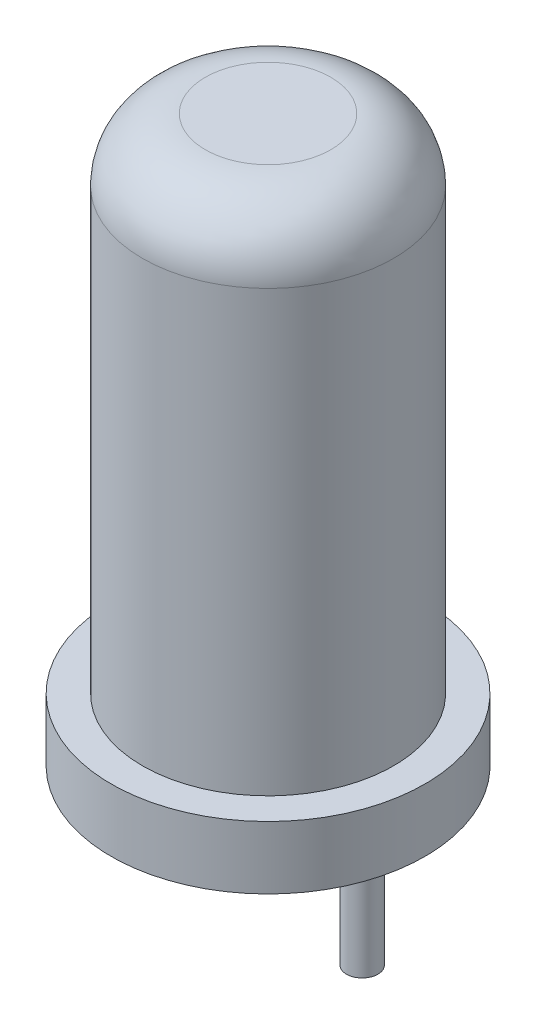
ISO-10303-21;
HEADER;
FILE_DESCRIPTION(('STEP AP214'),'2;1');
FILE_NAME('part.step','',(''),(''),'','','');
FILE_SCHEMA(('AUTOMOTIVE_DESIGN { 1 0 10303 214 1 1 1 1 }'));
ENDSEC;
DATA;
#1=APPLICATION_CONTEXT('core data for automotive mechanical design processes');
#2=APPLICATION_PROTOCOL_DEFINITION('international standard','automotive_design',2000,#1);
#3=PRODUCT_CONTEXT('',#1,'mechanical');
#4=PRODUCT('Part','Part','',(#3));
#5=PRODUCT_RELATED_PRODUCT_CATEGORY('part','',(#4));
#6=PRODUCT_DEFINITION_FORMATION('','',#4);
#7=PRODUCT_DEFINITION_CONTEXT('part definition',#1,'design');
#8=PRODUCT_DEFINITION('design','',#6,#7);
#9=PRODUCT_DEFINITION_SHAPE('','',#8);
#10=(LENGTH_UNIT() NAMED_UNIT(*) SI_UNIT(.MILLI.,.METRE.));
#11=(NAMED_UNIT(*) PLANE_ANGLE_UNIT() SI_UNIT($,.RADIAN.));
#12=(NAMED_UNIT(*) SI_UNIT($,.STERADIAN.) SOLID_ANGLE_UNIT());
#13=UNCERTAINTY_MEASURE_WITH_UNIT(LENGTH_MEASURE(1.E-05),#10,'distance_accuracy_value','');
#14=(GEOMETRIC_REPRESENTATION_CONTEXT(3) GLOBAL_UNCERTAINTY_ASSIGNED_CONTEXT((#13)) GLOBAL_UNIT_ASSIGNED_CONTEXT((#10,
#11,#12)) REPRESENTATION_CONTEXT('',''));
#15=CARTESIAN_POINT('',(0.,0.,0.));
#16=DIRECTION('',(0.,0.,1.));
#17=DIRECTION('',(1.,0.,0.));
#18=AXIS2_PLACEMENT_3D('',#15,#16,#17);
#19=CARTESIAN_POINT('',(-2.5,0.,0.));
#20=DIRECTION('',(0.,1.,0.));
#21=DIRECTION('',(0.,0.,1.));
#22=AXIS2_PLACEMENT_3D('',#19,#20,#21);
#23=PLANE('',#22);
#24=CARTESIAN_POINT('',(-1.5,0.,0.));
#25=DIRECTION('',(0.,1.,0.));
#26=DIRECTION('',(0.,0.,1.));
#27=AXIS2_PLACEMENT_3D('',#24,#25,#26);
#28=CIRCLE('',#27,0.25);
#29=CARTESIAN_POINT('',(-1.5,0.,0.25));
#30=VERTEX_POINT('',#29);
#31=EDGE_CURVE('E10',#30,#30,#28,.F.);
#32=ORIENTED_EDGE('',*,*,#31,.F.);
#33=EDGE_LOOP('',(#32));
#34=FACE_BOUND('',#33,.T.);
#35=CARTESIAN_POINT('',(1.5,0.,0.));
#36=DIRECTION('',(0.,1.,0.));
#37=DIRECTION('',(0.,0.,1.));
#38=AXIS2_PLACEMENT_3D('',#35,#36,#37);
#39=CIRCLE('',#38,0.25);
#40=CARTESIAN_POINT('',(1.5,0.,0.25));
#41=VERTEX_POINT('',#40);
#42=EDGE_CURVE('E42',#41,#41,#39,.F.);
#43=ORIENTED_EDGE('',*,*,#42,.F.);
#44=EDGE_LOOP('',(#43));
#45=FACE_BOUND('',#44,.T.);
#46=CARTESIAN_POINT('',(0.,0.,0.));
#47=DIRECTION('',(0.,-1.,0.));
#48=DIRECTION('',(0.,0.,-1.));
#49=AXIS2_PLACEMENT_3D('',#46,#47,#48);
#50=CIRCLE('',#49,2.5);
#51=CARTESIAN_POINT('',(0.,0.,-2.5));
#52=VERTEX_POINT('',#51);
#53=EDGE_CURVE('E61',#52,#52,#50,.T.);
#54=ORIENTED_EDGE('',*,*,#53,.T.);
#55=EDGE_LOOP('',(#54));
#56=FACE_BOUND('',#55,.T.);
#57=ADVANCED_FACE('F36',(#34,#45,#56),#23,.F.);
#58=CARTESIAN_POINT('',(0.,9.,0.));
#59=DIRECTION('',(0.,-1.,0.));
#60=DIRECTION('',(0.,0.,-1.));
#61=AXIS2_PLACEMENT_3D('',#58,#59,#60);
#62=PLANE('',#61);
#63=CARTESIAN_POINT('',(0.,9.,0.));
#64=DIRECTION('',(0.,-1.,0.));
#65=DIRECTION('',(0.,0.,-1.));
#66=AXIS2_PLACEMENT_3D('',#63,#64,#65);
#67=CIRCLE('',#66,1.);
#68=CARTESIAN_POINT('',(0.,9.,-1.));
#69=VERTEX_POINT('',#68);
#70=EDGE_CURVE('E46',#69,#69,#67,.T.);
#71=ORIENTED_EDGE('',*,*,#70,.F.);
#72=EDGE_LOOP('',(#71));
#73=FACE_BOUND('',#72,.T.);
#74=ADVANCED_FACE('F86',(#73),#62,.F.);
#75=CARTESIAN_POINT('',(0.,8.,0.));
#76=DIRECTION('',(0.,-1.,0.));
#77=DIRECTION('',(0.,0.,-1.));
#78=AXIS2_PLACEMENT_3D('',#75,#76,#77);
#79=DEGENERATE_TOROIDAL_SURFACE('',#78,1.,1.,.T.);
#80=CARTESIAN_POINT('',(0.,8.,0.));
#81=DIRECTION('',(0.,-1.,0.));
#82=DIRECTION('',(0.,0.,-1.));
#83=AXIS2_PLACEMENT_3D('',#80,#81,#82);
#84=CIRCLE('',#83,2.);
#85=CARTESIAN_POINT('',(0.,8.,-2.));
#86=VERTEX_POINT('',#85);
#87=EDGE_CURVE('E50',#86,#86,#84,.T.);
#88=ORIENTED_EDGE('',*,*,#87,.F.);
#89=EDGE_LOOP('',(#88));
#90=FACE_BOUND('',#89,.T.);
#91=ORIENTED_EDGE('',*,*,#70,.T.);
#92=EDGE_LOOP('',(#91));
#93=FACE_BOUND('',#92,.T.);
#94=ADVANCED_FACE('F91',(#90,#93),#79,.T.);
#95=CARTESIAN_POINT('',(0.,0.,0.));
#96=DIRECTION('',(0.,-1.,0.));
#97=DIRECTION('',(0.,0.,-1.));
#98=AXIS2_PLACEMENT_3D('',#95,#96,#97);
#99=CYLINDRICAL_SURFACE('',#98,2.);
#100=CARTESIAN_POINT('',(0.,0.999999999999998,0.));
#101=DIRECTION('',(0.,-1.,0.));
#102=DIRECTION('',(0.,0.,-1.));
#103=AXIS2_PLACEMENT_3D('',#100,#101,#102);
#104=CIRCLE('',#103,2.);
#105=CARTESIAN_POINT('',(0.,0.999999999999998,-2.));
#106=VERTEX_POINT('',#105);
#107=EDGE_CURVE('E55',#106,#106,#104,.T.);
#108=ORIENTED_EDGE('',*,*,#107,.F.);
#109=EDGE_LOOP('',(#108));
#110=FACE_BOUND('',#109,.T.);
#111=ORIENTED_EDGE('',*,*,#87,.T.);
#112=EDGE_LOOP('',(#111));
#113=FACE_BOUND('',#112,.T.);
#114=ADVANCED_FACE('F106',(#110,#113),#99,.T.);
#115=CARTESIAN_POINT('',(-2.5,0.999999999999998,0.));
#116=DIRECTION('',(0.,-1.,0.));
#117=DIRECTION('',(0.,0.,-1.));
#118=AXIS2_PLACEMENT_3D('',#115,#116,#117);
#119=PLANE('',#118);
#120=CARTESIAN_POINT('',(0.,0.999999999999998,0.));
#121=DIRECTION('',(0.,-1.,0.));
#122=DIRECTION('',(0.,0.,-1.));
#123=AXIS2_PLACEMENT_3D('',#120,#121,#122);
#124=CIRCLE('',#123,2.5);
#125=CARTESIAN_POINT('',(0.,0.999999999999998,-2.5));
#126=VERTEX_POINT('',#125);
#127=EDGE_CURVE('E58',#126,#126,#124,.T.);
#128=ORIENTED_EDGE('',*,*,#127,.F.);
#129=EDGE_LOOP('',(#128));
#130=FACE_BOUND('',#129,.T.);
#131=ORIENTED_EDGE('',*,*,#107,.T.);
#132=EDGE_LOOP('',(#131));
#133=FACE_BOUND('',#132,.T.);
#134=ADVANCED_FACE('F100',(#130,#133),#119,.F.);
#135=CARTESIAN_POINT('',(0.,0.,0.));
#136=DIRECTION('',(0.,-1.,0.));
#137=DIRECTION('',(0.,0.,-1.));
#138=AXIS2_PLACEMENT_3D('',#135,#136,#137);
#139=CYLINDRICAL_SURFACE('',#138,2.5);
#140=ORIENTED_EDGE('',*,*,#53,.F.);
#141=EDGE_LOOP('',(#140));
#142=FACE_BOUND('',#141,.T.);
#143=ORIENTED_EDGE('',*,*,#127,.T.);
#144=EDGE_LOOP('',(#143));
#145=FACE_BOUND('',#144,.T.);
#146=ADVANCED_FACE('F97',(#142,#145),#139,.T.);
#147=CARTESIAN_POINT('',(1.5,-2.,0.));
#148=DIRECTION('',(0.,1.,0.));
#149=DIRECTION('',(0.,0.,1.));
#150=AXIS2_PLACEMENT_3D('',#147,#148,#149);
#151=CYLINDRICAL_SURFACE('',#150,0.25);
#152=CARTESIAN_POINT('',(1.5,-2.,0.));
#153=DIRECTION('',(0.,-1.,0.));
#154=DIRECTION('',(0.,0.,-1.));
#155=AXIS2_PLACEMENT_3D('',#152,#153,#154);
#156=CIRCLE('',#155,0.25);
#157=CARTESIAN_POINT('',(1.5,-2.,-0.25));
#158=VERTEX_POINT('',#157);
#159=EDGE_CURVE('E64',#158,#158,#156,.T.);
#160=ORIENTED_EDGE('',*,*,#159,.F.);
#161=EDGE_LOOP('',(#160));
#162=FACE_BOUND('',#161,.T.);
#163=ORIENTED_EDGE('',*,*,#42,.T.);
#164=EDGE_LOOP('',(#163));
#165=FACE_BOUND('',#164,.T.);
#166=ADVANCED_FACE('F82',(#162,#165),#151,.T.);
#167=CARTESIAN_POINT('',(1.5,-2.,0.));
#168=DIRECTION('',(0.,-1.,0.));
#169=DIRECTION('',(0.,0.,-1.));
#170=AXIS2_PLACEMENT_3D('',#167,#168,#169);
#171=PLANE('',#170);
#172=ORIENTED_EDGE('',*,*,#159,.T.);
#173=EDGE_LOOP('',(#172));
#174=FACE_BOUND('',#173,.T.);
#175=ADVANCED_FACE('F75',(#174),#171,.T.);
#176=CARTESIAN_POINT('',(-1.5,-2.,0.));
#177=DIRECTION('',(0.,1.,0.));
#178=DIRECTION('',(0.,0.,1.));
#179=AXIS2_PLACEMENT_3D('',#176,#177,#178);
#180=CYLINDRICAL_SURFACE('',#179,0.25);
#181=CARTESIAN_POINT('',(-1.5,-2.,0.));
#182=DIRECTION('',(0.,-1.,0.));
#183=DIRECTION('',(0.,0.,-1.));
#184=AXIS2_PLACEMENT_3D('',#181,#182,#183);
#185=CIRCLE('',#184,0.25);
#186=CARTESIAN_POINT('',(-1.5,-2.,-0.25));
#187=VERTEX_POINT('',#186);
#188=EDGE_CURVE('E67',#187,#187,#185,.T.);
#189=ORIENTED_EDGE('',*,*,#188,.F.);
#190=EDGE_LOOP('',(#189));
#191=FACE_BOUND('',#190,.T.);
#192=ORIENTED_EDGE('',*,*,#31,.T.);
#193=EDGE_LOOP('',(#192));
#194=FACE_BOUND('',#193,.T.);
#195=ADVANCED_FACE('F73',(#191,#194),#180,.T.);
#196=CARTESIAN_POINT('',(-1.5,-2.,0.));
#197=DIRECTION('',(0.,-1.,0.));
#198=DIRECTION('',(0.,0.,-1.));
#199=AXIS2_PLACEMENT_3D('',#196,#197,#198);
#200=PLANE('',#199);
#201=ORIENTED_EDGE('',*,*,#188,.T.);
#202=EDGE_LOOP('',(#201));
#203=FACE_BOUND('',#202,.T.);
#204=ADVANCED_FACE('F71',(#203),#200,.T.);
#205=CLOSED_SHELL('',(#57,#74,#94,#114,#134,#146,#166,#175,#195,#204));
#206=MANIFOLD_SOLID_BREP('B2',#205);
#207=ADVANCED_BREP_SHAPE_REPRESENTATION('',(#18,#206),#14);
#208=SHAPE_DEFINITION_REPRESENTATION(#9,#207);
ENDSEC;
END-ISO-10303-21;
